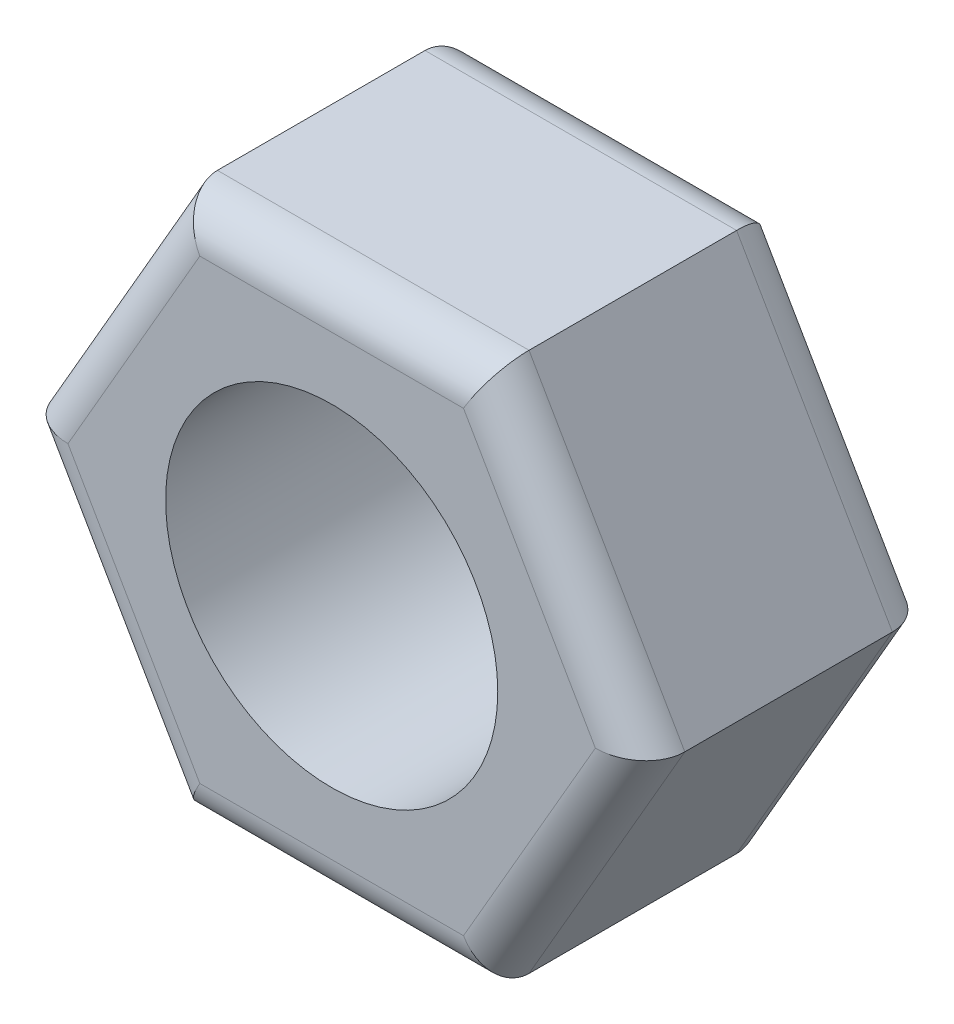
ISO-10303-21;
HEADER;
FILE_DESCRIPTION(('STEP AP214'),'2;1');
FILE_NAME('part.step','',(''),(''),'','','');
FILE_SCHEMA(('AUTOMOTIVE_DESIGN { 1 0 10303 214 1 1 1 1 }'));
ENDSEC;
DATA;
#1=APPLICATION_CONTEXT('core data for automotive mechanical design processes');
#2=APPLICATION_PROTOCOL_DEFINITION('international standard','automotive_design',2000,#1);
#3=PRODUCT_CONTEXT('',#1,'mechanical');
#4=PRODUCT('Part','Part','',(#3));
#5=PRODUCT_RELATED_PRODUCT_CATEGORY('part','',(#4));
#6=PRODUCT_DEFINITION_FORMATION('','',#4);
#7=PRODUCT_DEFINITION_CONTEXT('part definition',#1,'design');
#8=PRODUCT_DEFINITION('design','',#6,#7);
#9=PRODUCT_DEFINITION_SHAPE('','',#8);
#10=(LENGTH_UNIT() NAMED_UNIT(*) SI_UNIT(.MILLI.,.METRE.));
#11=(NAMED_UNIT(*) PLANE_ANGLE_UNIT() SI_UNIT($,.RADIAN.));
#12=(NAMED_UNIT(*) SI_UNIT($,.STERADIAN.) SOLID_ANGLE_UNIT());
#13=UNCERTAINTY_MEASURE_WITH_UNIT(LENGTH_MEASURE(1.E-05),#10,'distance_accuracy_value','');
#14=(GEOMETRIC_REPRESENTATION_CONTEXT(3) GLOBAL_UNCERTAINTY_ASSIGNED_CONTEXT((#13)) GLOBAL_UNIT_ASSIGNED_CONTEXT((#10,
#11,#12)) REPRESENTATION_CONTEXT('',''));
#15=CARTESIAN_POINT('',(0.,0.,0.));
#16=DIRECTION('',(0.,0.,1.));
#17=DIRECTION('',(1.,0.,0.));
#18=AXIS2_PLACEMENT_3D('',#15,#16,#17);
#19=CARTESIAN_POINT('',(0.,0.,3.5));
#20=DIRECTION('',(0.,0.,-1.));
#21=DIRECTION('',(-1.,0.,0.));
#22=AXIS2_PLACEMENT_3D('',#19,#20,#21);
#23=PLANE('',#22);
#24=DIRECTION('',(-0.5,0.866025403784439,0.));
#25=VECTOR('',#24,1.);
#26=CARTESIAN_POINT('',(2.38156986040721,1.375,3.5));
#27=LINE('',#26,#25);
#28=CARTESIAN_POINT('',(3.17542648054294,0.,3.5));
#29=VERTEX_POINT('',#28);
#30=CARTESIAN_POINT('',(1.58771324027147,2.75,3.5));
#31=VERTEX_POINT('',#30);
#32=EDGE_CURVE('E150',#29,#31,#27,.T.);
#33=ORIENTED_EDGE('',*,*,#32,.T.);
#34=DIRECTION('',(-1.,0.,0.));
#35=VECTOR('',#34,1.);
#36=CARTESIAN_POINT('',(0.,2.75,3.5));
#37=LINE('',#36,#35);
#38=CARTESIAN_POINT('',(-1.58771324027147,2.75,3.5));
#39=VERTEX_POINT('',#38);
#40=EDGE_CURVE('E131',#31,#39,#37,.T.);
#41=ORIENTED_EDGE('',*,*,#40,.T.);
#42=DIRECTION('',(-0.5,-0.866025403784438,0.));
#43=VECTOR('',#42,1.);
#44=CARTESIAN_POINT('',(-2.38156986040721,1.375,3.5));
#45=LINE('',#44,#43);
#46=CARTESIAN_POINT('',(-3.17542648054294,0.,3.5));
#47=VERTEX_POINT('',#46);
#48=EDGE_CURVE('E139',#39,#47,#45,.T.);
#49=ORIENTED_EDGE('',*,*,#48,.T.);
#50=DIRECTION('',(0.5,-0.866025403784439,0.));
#51=VECTOR('',#50,1.);
#52=CARTESIAN_POINT('',(-2.38156986040721,-1.375,3.5));
#53=LINE('',#52,#51);
#54=CARTESIAN_POINT('',(-1.58771324027147,-2.75,3.5));
#55=VERTEX_POINT('',#54);
#56=EDGE_CURVE('E145',#47,#55,#53,.T.);
#57=ORIENTED_EDGE('',*,*,#56,.T.);
#58=DIRECTION('',(1.,0.,0.));
#59=VECTOR('',#58,1.);
#60=CARTESIAN_POINT('',(0.,-2.75,3.5));
#61=LINE('',#60,#59);
#62=CARTESIAN_POINT('',(1.58771324027147,-2.75,3.5));
#63=VERTEX_POINT('',#62);
#64=EDGE_CURVE('E254',#55,#63,#61,.T.);
#65=ORIENTED_EDGE('',*,*,#64,.T.);
#66=DIRECTION('',(0.5,0.866025403784439,0.));
#67=VECTOR('',#66,1.);
#68=CARTESIAN_POINT('',(2.38156986040721,-1.375,3.5));
#69=LINE('',#68,#67);
#70=EDGE_CURVE('E155',#63,#29,#69,.T.);
#71=ORIENTED_EDGE('',*,*,#70,.T.);
#72=EDGE_LOOP('',(#33,#41,#49,#57,#65,#71));
#73=FACE_BOUND('',#72,.T.);
#74=CARTESIAN_POINT('',(0.,0.,3.5));
#75=DIRECTION('',(0.,0.,1.));
#76=DIRECTION('',(1.,0.,0.));
#77=AXIS2_PLACEMENT_3D('',#74,#75,#76);
#78=CIRCLE('',#77,2.);
#79=CARTESIAN_POINT('',(2.,0.,3.5));
#80=VERTEX_POINT('',#79);
#81=EDGE_CURVE('E278',#80,#80,#78,.T.);
#82=ORIENTED_EDGE('',*,*,#81,.F.);
#83=EDGE_LOOP('',(#82));
#84=FACE_BOUND('',#83,.T.);
#85=ADVANCED_FACE('F37',(#73,#84),#23,.F.);
#86=CARTESIAN_POINT('',(0.,0.,0.));
#87=DIRECTION('',(0.,0.,-1.));
#88=DIRECTION('',(-1.,0.,0.));
#89=AXIS2_PLACEMENT_3D('',#86,#87,#88);
#90=PLANE('',#89);
#91=DIRECTION('',(0.5,0.866025403784439,0.));
#92=VECTOR('',#91,1.);
#93=CARTESIAN_POINT('',(1.44337567297406,-3.,0.));
#94=LINE('',#93,#92);
#95=CARTESIAN_POINT('',(3.17542648054294,0.,0.));
#96=VERTEX_POINT('',#95);
#97=CARTESIAN_POINT('',(1.58771324027147,-2.75,0.));
#98=VERTEX_POINT('',#97);
#99=EDGE_CURVE('E46',#96,#98,#94,.F.);
#100=ORIENTED_EDGE('',*,*,#99,.T.);
#101=DIRECTION('',(1.,0.,0.));
#102=VECTOR('',#101,1.);
#103=CARTESIAN_POINT('',(-1.87638837486628,-2.75,0.));
#104=LINE('',#103,#102);
#105=CARTESIAN_POINT('',(-1.58771324027147,-2.75,0.));
#106=VERTEX_POINT('',#105);
#107=EDGE_CURVE('E11',#98,#106,#104,.F.);
#108=ORIENTED_EDGE('',*,*,#107,.T.);
#109=DIRECTION('',(0.5,-0.866025403784439,0.));
#110=VECTOR('',#109,1.);
#111=CARTESIAN_POINT('',(-3.31976404784035,0.250000000000002,0.));
#112=LINE('',#111,#110);
#113=CARTESIAN_POINT('',(-3.17542648054294,0.,0.));
#114=VERTEX_POINT('',#113);
#115=EDGE_CURVE('E181',#106,#114,#112,.F.);
#116=ORIENTED_EDGE('',*,*,#115,.T.);
#117=DIRECTION('',(-0.5,-0.866025403784438,0.));
#118=VECTOR('',#117,1.);
#119=CARTESIAN_POINT('',(-1.44337567297406,3.,0.));
#120=LINE('',#119,#118);
#121=CARTESIAN_POINT('',(-1.58771324027147,2.75,0.));
#122=VERTEX_POINT('',#121);
#123=EDGE_CURVE('E183',#114,#122,#120,.F.);
#124=ORIENTED_EDGE('',*,*,#123,.T.);
#125=DIRECTION('',(-1.,0.,0.));
#126=VECTOR('',#125,1.);
#127=CARTESIAN_POINT('',(1.87638837486628,2.75,0.));
#128=LINE('',#127,#126);
#129=CARTESIAN_POINT('',(1.58771324027147,2.75,0.));
#130=VERTEX_POINT('',#129);
#131=EDGE_CURVE('E185',#122,#130,#128,.F.);
#132=ORIENTED_EDGE('',*,*,#131,.T.);
#133=DIRECTION('',(-0.5,0.866025403784439,0.));
#134=VECTOR('',#133,1.);
#135=CARTESIAN_POINT('',(3.31976404784035,-0.250000000000001,0.));
#136=LINE('',#135,#134);
#137=EDGE_CURVE('E57',#130,#96,#136,.F.);
#138=ORIENTED_EDGE('',*,*,#137,.T.);
#139=EDGE_LOOP('',(#100,#108,#116,#124,#132,#138));
#140=FACE_BOUND('',#139,.T.);
#141=CARTESIAN_POINT('',(0.,0.,0.));
#142=DIRECTION('',(0.,0.,1.));
#143=DIRECTION('',(1.,0.,0.));
#144=AXIS2_PLACEMENT_3D('',#141,#142,#143);
#145=CIRCLE('',#144,2.);
#146=CARTESIAN_POINT('',(2.,0.,0.));
#147=VERTEX_POINT('',#146);
#148=EDGE_CURVE('E200',#147,#147,#145,.T.);
#149=ORIENTED_EDGE('',*,*,#148,.T.);
#150=EDGE_LOOP('',(#149));
#151=FACE_BOUND('',#150,.T.);
#152=ADVANCED_FACE('F225',(#140,#151),#90,.T.);
#153=CARTESIAN_POINT('',(-1.87638837486628,-3.25,3.5));
#154=DIRECTION('',(0.866025403784439,0.5,0.));
#155=DIRECTION('',(-0.5,0.866025403784439,0.));
#156=AXIS2_PLACEMENT_3D('',#153,#154,#155);
#157=PLANE('',#156);
#158=DIRECTION('',(0.,0.,-1.));
#159=VECTOR('',#158,1.);
#160=CARTESIAN_POINT('',(-1.87638837486628,-3.25,3.5));
#161=LINE('',#160,#159);
#162=CARTESIAN_POINT('',(-1.87638837486628,-3.25,3.));
#163=VERTEX_POINT('',#162);
#164=CARTESIAN_POINT('',(-1.87638837486628,-3.25,0.5));
#165=VERTEX_POINT('',#164);
#166=EDGE_CURVE('E238',#163,#165,#161,.T.);
#167=ORIENTED_EDGE('',*,*,#166,.F.);
#168=DIRECTION('',(0.5,-0.866025403784439,0.));
#169=VECTOR('',#168,1.);
#170=CARTESIAN_POINT('',(-1.87638837486628,-3.25,3.));
#171=LINE('',#170,#169);
#172=CARTESIAN_POINT('',(-3.75277674973257,0.,3.));
#173=VERTEX_POINT('',#172);
#174=EDGE_CURVE('E175',#163,#173,#171,.F.);
#175=ORIENTED_EDGE('',*,*,#174,.T.);
#176=DIRECTION('',(0.,0.,-1.));
#177=VECTOR('',#176,1.);
#178=CARTESIAN_POINT('',(-3.75277674973257,0.,3.5));
#179=LINE('',#178,#177);
#180=CARTESIAN_POINT('',(-3.75277674973257,0.,0.5));
#181=VERTEX_POINT('',#180);
#182=EDGE_CURVE('E146',#173,#181,#179,.T.);
#183=ORIENTED_EDGE('',*,*,#182,.T.);
#184=DIRECTION('',(0.5,-0.866025403784439,0.));
#185=VECTOR('',#184,1.);
#186=CARTESIAN_POINT('',(-1.87638837486628,-3.25,0.5));
#187=LINE('',#186,#185);
#188=EDGE_CURVE('E173',#181,#165,#187,.T.);
#189=ORIENTED_EDGE('',*,*,#188,.T.);
#190=EDGE_LOOP('',(#167,#175,#183,#189));
#191=FACE_BOUND('',#190,.T.);
#192=ADVANCED_FACE('F237',(#191),#157,.F.);
#193=CARTESIAN_POINT('',(1.87638837486628,-3.25,3.5));
#194=DIRECTION('',(0.,1.,0.));
#195=DIRECTION('',(-1.,0.,0.));
#196=AXIS2_PLACEMENT_3D('',#193,#194,#195);
#197=PLANE('',#196);
#198=DIRECTION('',(0.,0.,-1.));
#199=VECTOR('',#198,1.);
#200=CARTESIAN_POINT('',(1.87638837486628,-3.25,3.5));
#201=LINE('',#200,#199);
#202=CARTESIAN_POINT('',(1.87638837486628,-3.25,3.));
#203=VERTEX_POINT('',#202);
#204=CARTESIAN_POINT('',(1.87638837486628,-3.25,0.5));
#205=VERTEX_POINT('',#204);
#206=EDGE_CURVE('E246',#203,#205,#201,.T.);
#207=ORIENTED_EDGE('',*,*,#206,.F.);
#208=DIRECTION('',(1.,0.,0.));
#209=VECTOR('',#208,1.);
#210=CARTESIAN_POINT('',(1.87638837486628,-3.25,3.));
#211=LINE('',#210,#209);
#212=EDGE_CURVE('E171',#203,#163,#211,.F.);
#213=ORIENTED_EDGE('',*,*,#212,.T.);
#214=ORIENTED_EDGE('',*,*,#166,.T.);
#215=DIRECTION('',(1.,0.,0.));
#216=VECTOR('',#215,1.);
#217=CARTESIAN_POINT('',(1.87638837486628,-3.25,0.5));
#218=LINE('',#217,#216);
#219=EDGE_CURVE('E168',#165,#205,#218,.T.);
#220=ORIENTED_EDGE('',*,*,#219,.T.);
#221=EDGE_LOOP('',(#207,#213,#214,#220));
#222=FACE_BOUND('',#221,.T.);
#223=ADVANCED_FACE('F243',(#222),#197,.F.);
#224=CARTESIAN_POINT('',(3.75277674973257,0.,3.5));
#225=DIRECTION('',(-0.866025403784439,0.5,0.));
#226=DIRECTION('',(-0.5,-0.866025403784439,0.));
#227=AXIS2_PLACEMENT_3D('',#224,#225,#226);
#228=PLANE('',#227);
#229=DIRECTION('',(0.,0.,-1.));
#230=VECTOR('',#229,1.);
#231=CARTESIAN_POINT('',(3.75277674973257,0.,3.5));
#232=LINE('',#231,#230);
#233=CARTESIAN_POINT('',(3.75277674973257,0.,3.));
#234=VERTEX_POINT('',#233);
#235=CARTESIAN_POINT('',(3.75277674973257,0.,0.5));
#236=VERTEX_POINT('',#235);
#237=EDGE_CURVE('E249',#234,#236,#232,.T.);
#238=ORIENTED_EDGE('',*,*,#237,.F.);
#239=DIRECTION('',(0.5,0.866025403784439,0.));
#240=VECTOR('',#239,1.);
#241=CARTESIAN_POINT('',(3.75277674973257,0.,3.));
#242=LINE('',#241,#240);
#243=EDGE_CURVE('E166',#234,#203,#242,.F.);
#244=ORIENTED_EDGE('',*,*,#243,.T.);
#245=ORIENTED_EDGE('',*,*,#206,.T.);
#246=DIRECTION('',(0.5,0.866025403784439,0.));
#247=VECTOR('',#246,1.);
#248=CARTESIAN_POINT('',(3.75277674973257,0.,0.5));
#249=LINE('',#248,#247);
#250=EDGE_CURVE('E164',#205,#236,#249,.T.);
#251=ORIENTED_EDGE('',*,*,#250,.T.);
#252=EDGE_LOOP('',(#238,#244,#245,#251));
#253=FACE_BOUND('',#252,.T.);
#254=ADVANCED_FACE('F304',(#253),#228,.F.);
#255=CARTESIAN_POINT('',(1.87638837486628,3.25,3.5));
#256=DIRECTION('',(-0.866025403784439,-0.5,0.));
#257=DIRECTION('',(0.5,-0.866025403784439,0.));
#258=AXIS2_PLACEMENT_3D('',#255,#256,#257);
#259=PLANE('',#258);
#260=DIRECTION('',(0.,0.,-1.));
#261=VECTOR('',#260,1.);
#262=CARTESIAN_POINT('',(1.87638837486628,3.25,3.5));
#263=LINE('',#262,#261);
#264=CARTESIAN_POINT('',(1.87638837486628,3.25,3.));
#265=VERTEX_POINT('',#264);
#266=CARTESIAN_POINT('',(1.87638837486628,3.25,0.5));
#267=VERTEX_POINT('',#266);
#268=EDGE_CURVE('E273',#265,#267,#263,.T.);
#269=ORIENTED_EDGE('',*,*,#268,.F.);
#270=DIRECTION('',(-0.5,0.866025403784439,0.));
#271=VECTOR('',#270,1.);
#272=CARTESIAN_POINT('',(1.87638837486628,3.25,3.));
#273=LINE('',#272,#271);
#274=EDGE_CURVE('E162',#265,#234,#273,.F.);
#275=ORIENTED_EDGE('',*,*,#274,.T.);
#276=ORIENTED_EDGE('',*,*,#237,.T.);
#277=DIRECTION('',(-0.5,0.866025403784439,0.));
#278=VECTOR('',#277,1.);
#279=CARTESIAN_POINT('',(1.87638837486628,3.25,0.5));
#280=LINE('',#279,#278);
#281=EDGE_CURVE('E160',#236,#267,#280,.T.);
#282=ORIENTED_EDGE('',*,*,#281,.T.);
#283=EDGE_LOOP('',(#269,#275,#276,#282));
#284=FACE_BOUND('',#283,.T.);
#285=ADVANCED_FACE('F276',(#284),#259,.F.);
#286=CARTESIAN_POINT('',(-1.87638837486628,3.25,3.5));
#287=DIRECTION('',(0.,-1.,0.));
#288=DIRECTION('',(1.,0.,0.));
#289=AXIS2_PLACEMENT_3D('',#286,#287,#288);
#290=PLANE('',#289);
#291=DIRECTION('',(0.,0.,-1.));
#292=VECTOR('',#291,1.);
#293=CARTESIAN_POINT('',(-1.87638837486628,3.25,3.5));
#294=LINE('',#293,#292);
#295=CARTESIAN_POINT('',(-1.87638837486628,3.25,3.));
#296=VERTEX_POINT('',#295);
#297=CARTESIAN_POINT('',(-1.87638837486628,3.25,0.5));
#298=VERTEX_POINT('',#297);
#299=EDGE_CURVE('E275',#296,#298,#294,.T.);
#300=ORIENTED_EDGE('',*,*,#299,.F.);
#301=DIRECTION('',(-1.,0.,0.));
#302=VECTOR('',#301,1.);
#303=CARTESIAN_POINT('',(-1.87638837486628,3.25,3.));
#304=LINE('',#303,#302);
#305=EDGE_CURVE('E133',#296,#265,#304,.F.);
#306=ORIENTED_EDGE('',*,*,#305,.T.);
#307=ORIENTED_EDGE('',*,*,#268,.T.);
#308=DIRECTION('',(-1.,0.,0.));
#309=VECTOR('',#308,1.);
#310=CARTESIAN_POINT('',(-1.87638837486628,3.25,0.5));
#311=LINE('',#310,#309);
#312=EDGE_CURVE('E152',#267,#298,#311,.T.);
#313=ORIENTED_EDGE('',*,*,#312,.T.);
#314=EDGE_LOOP('',(#300,#306,#307,#313));
#315=FACE_BOUND('',#314,.T.);
#316=ADVANCED_FACE('F272',(#315),#290,.F.);
#317=CARTESIAN_POINT('',(-2.81458256229943,1.625,3.5));
#318=DIRECTION('',(0.866025403784438,-0.5,0.));
#319=DIRECTION('',(0.5,0.866025403784438,0.));
#320=AXIS2_PLACEMENT_3D('',#317,#318,#319);
#321=PLANE('',#320);
#322=ORIENTED_EDGE('',*,*,#182,.F.);
#323=DIRECTION('',(-0.5,-0.866025403784438,0.));
#324=VECTOR('',#323,1.);
#325=CARTESIAN_POINT('',(-2.81458256229943,1.625,3.));
#326=LINE('',#325,#324);
#327=EDGE_CURVE('E179',#173,#296,#326,.F.);
#328=ORIENTED_EDGE('',*,*,#327,.T.);
#329=ORIENTED_EDGE('',*,*,#299,.T.);
#330=DIRECTION('',(-0.5,-0.866025403784438,0.));
#331=VECTOR('',#330,1.);
#332=CARTESIAN_POINT('',(-3.75277674973257,0.,0.5));
#333=LINE('',#332,#331);
#334=EDGE_CURVE('E177',#298,#181,#333,.T.);
#335=ORIENTED_EDGE('',*,*,#334,.T.);
#336=EDGE_LOOP('',(#322,#328,#329,#335));
#337=FACE_BOUND('',#336,.T.);
#338=ADVANCED_FACE('F296',(#337),#321,.F.);
#339=CARTESIAN_POINT('',(0.,0.,3.5));
#340=DIRECTION('',(0.,0.,-1.));
#341=DIRECTION('',(-1.,0.,0.));
#342=AXIS2_PLACEMENT_3D('',#339,#340,#341);
#343=CYLINDRICAL_SURFACE('',#342,2.);
#344=ORIENTED_EDGE('',*,*,#81,.T.);
#345=EDGE_LOOP('',(#344));
#346=FACE_BOUND('',#345,.T.);
#347=ORIENTED_EDGE('',*,*,#148,.F.);
#348=EDGE_LOOP('',(#347));
#349=FACE_BOUND('',#348,.T.);
#350=ADVANCED_FACE('F286',(#346,#349),#343,.F.);
#351=CARTESIAN_POINT('',(0.,-2.75,3.));
#352=DIRECTION('',(1.,0.,0.));
#353=DIRECTION('',(0.,1.,0.));
#354=AXIS2_PLACEMENT_3D('',#351,#352,#353);
#355=CYLINDRICAL_SURFACE('',#354,0.5);
#356=CARTESIAN_POINT('',(-1.58771324027147,-2.75,3.));
#357=DIRECTION('',(0.866025403784439,-0.5,0.));
#358=DIRECTION('',(-0.5,-0.866025403784439,0.));
#359=AXIS2_PLACEMENT_3D('',#356,#357,#358);
#360=ELLIPSE('',#359,0.577350269189626,0.5);
#361=EDGE_CURVE('E194',#163,#55,#360,.F.);
#362=ORIENTED_EDGE('',*,*,#361,.F.);
#363=ORIENTED_EDGE('',*,*,#212,.F.);
#364=CARTESIAN_POINT('',(1.58771324027147,-2.75,3.));
#365=DIRECTION('',(0.866025403784439,0.5,0.));
#366=DIRECTION('',(0.5,-0.866025403784439,0.));
#367=AXIS2_PLACEMENT_3D('',#364,#365,#366);
#368=ELLIPSE('',#367,0.577350269189626,0.5);
#369=EDGE_CURVE('E197',#63,#203,#368,.T.);
#370=ORIENTED_EDGE('',*,*,#369,.F.);
#371=ORIENTED_EDGE('',*,*,#64,.F.);
#372=EDGE_LOOP('',(#362,#363,#370,#371));
#373=FACE_BOUND('',#372,.T.);
#374=ADVANCED_FACE('F324',(#373),#355,.T.);
#375=CARTESIAN_POINT('',(2.38156986040721,-1.375,3.));
#376=DIRECTION('',(0.5,0.866025403784439,0.));
#377=DIRECTION('',(-0.866025403784439,0.5,0.));
#378=AXIS2_PLACEMENT_3D('',#375,#376,#377);
#379=CYLINDRICAL_SURFACE('',#378,0.5);
#380=ORIENTED_EDGE('',*,*,#369,.T.);
#381=ORIENTED_EDGE('',*,*,#243,.F.);
#382=CARTESIAN_POINT('',(3.17542648054294,0.,3.));
#383=DIRECTION('',(0.,1.,0.));
#384=DIRECTION('',(1.,0.,0.));
#385=AXIS2_PLACEMENT_3D('',#382,#383,#384);
#386=ELLIPSE('',#385,0.577350269189626,0.5);
#387=EDGE_CURVE('E191',#29,#234,#386,.T.);
#388=ORIENTED_EDGE('',*,*,#387,.F.);
#389=ORIENTED_EDGE('',*,*,#70,.F.);
#390=EDGE_LOOP('',(#380,#381,#388,#389));
#391=FACE_BOUND('',#390,.T.);
#392=ADVANCED_FACE('F261',(#391),#379,.T.);
#393=CARTESIAN_POINT('',(-2.38156986040721,-1.375,3.));
#394=DIRECTION('',(0.5,-0.866025403784439,0.));
#395=DIRECTION('',(0.866025403784439,0.5,0.));
#396=AXIS2_PLACEMENT_3D('',#393,#394,#395);
#397=CYLINDRICAL_SURFACE('',#396,0.5);
#398=ORIENTED_EDGE('',*,*,#361,.T.);
#399=ORIENTED_EDGE('',*,*,#56,.F.);
#400=CARTESIAN_POINT('',(-3.17542648054294,0.,3.));
#401=DIRECTION('',(0.,-1.,0.));
#402=DIRECTION('',(-1.,0.,0.));
#403=AXIS2_PLACEMENT_3D('',#400,#401,#402);
#404=ELLIPSE('',#403,0.577350269189626,0.5);
#405=EDGE_CURVE('E142',#173,#47,#404,.F.);
#406=ORIENTED_EDGE('',*,*,#405,.F.);
#407=ORIENTED_EDGE('',*,*,#174,.F.);
#408=EDGE_LOOP('',(#398,#399,#406,#407));
#409=FACE_BOUND('',#408,.T.);
#410=ADVANCED_FACE('F318',(#409),#397,.T.);
#411=CARTESIAN_POINT('',(2.38156986040721,1.375,3.));
#412=DIRECTION('',(-0.5,0.866025403784439,0.));
#413=DIRECTION('',(-0.866025403784439,-0.5,0.));
#414=AXIS2_PLACEMENT_3D('',#411,#412,#413);
#415=CYLINDRICAL_SURFACE('',#414,0.5);
#416=ORIENTED_EDGE('',*,*,#387,.T.);
#417=ORIENTED_EDGE('',*,*,#274,.F.);
#418=CARTESIAN_POINT('',(1.58771324027147,2.75,3.));
#419=DIRECTION('',(-0.866025403784439,0.5,0.));
#420=DIRECTION('',(0.5,0.866025403784439,0.));
#421=AXIS2_PLACEMENT_3D('',#418,#419,#420);
#422=ELLIPSE('',#421,0.577350269189626,0.5);
#423=EDGE_CURVE('E136',#31,#265,#422,.T.);
#424=ORIENTED_EDGE('',*,*,#423,.F.);
#425=ORIENTED_EDGE('',*,*,#32,.F.);
#426=EDGE_LOOP('',(#416,#417,#424,#425));
#427=FACE_BOUND('',#426,.T.);
#428=ADVANCED_FACE('F264',(#427),#415,.T.);
#429=CARTESIAN_POINT('',(-2.38156986040721,1.375,3.));
#430=DIRECTION('',(-0.5,-0.866025403784438,0.));
#431=DIRECTION('',(0.866025403784438,-0.5,0.));
#432=AXIS2_PLACEMENT_3D('',#429,#430,#431);
#433=CYLINDRICAL_SURFACE('',#432,0.5);
#434=ORIENTED_EDGE('',*,*,#405,.T.);
#435=ORIENTED_EDGE('',*,*,#48,.F.);
#436=CARTESIAN_POINT('',(-1.58771324027147,2.75,3.));
#437=DIRECTION('',(-0.866025403784439,-0.5,0.));
#438=DIRECTION('',(0.5,-0.866025403784439,0.));
#439=AXIS2_PLACEMENT_3D('',#436,#437,#438);
#440=ELLIPSE('',#439,0.577350269189626,0.5);
#441=EDGE_CURVE('E127',#296,#39,#440,.F.);
#442=ORIENTED_EDGE('',*,*,#441,.F.);
#443=ORIENTED_EDGE('',*,*,#327,.F.);
#444=EDGE_LOOP('',(#434,#435,#442,#443));
#445=FACE_BOUND('',#444,.T.);
#446=ADVANCED_FACE('F140',(#445),#433,.T.);
#447=CARTESIAN_POINT('',(0.,2.75,3.));
#448=DIRECTION('',(-1.,0.,0.));
#449=DIRECTION('',(0.,-1.,0.));
#450=AXIS2_PLACEMENT_3D('',#447,#448,#449);
#451=CYLINDRICAL_SURFACE('',#450,0.5);
#452=ORIENTED_EDGE('',*,*,#423,.T.);
#453=ORIENTED_EDGE('',*,*,#305,.F.);
#454=ORIENTED_EDGE('',*,*,#441,.T.);
#455=ORIENTED_EDGE('',*,*,#40,.F.);
#456=EDGE_LOOP('',(#452,#453,#454,#455));
#457=FACE_BOUND('',#456,.T.);
#458=ADVANCED_FACE('F129',(#457),#451,.T.);
#459=CARTESIAN_POINT('',(-1.87638837486628,2.75,0.5));
#460=DIRECTION('',(1.,0.,0.));
#461=DIRECTION('',(0.,1.,0.));
#462=AXIS2_PLACEMENT_3D('',#459,#460,#461);
#463=CYLINDRICAL_SURFACE('',#462,0.5);
#464=CARTESIAN_POINT('',(1.58771324027147,2.75,0.5));
#465=DIRECTION('',(0.866025403784439,-0.5,0.));
#466=DIRECTION('',(0.5,0.866025403784439,0.));
#467=AXIS2_PLACEMENT_3D('',#464,#465,#466);
#468=ELLIPSE('',#467,0.577350269189626,0.5);
#469=EDGE_CURVE('E210',#130,#267,#468,.T.);
#470=ORIENTED_EDGE('',*,*,#469,.F.);
#471=ORIENTED_EDGE('',*,*,#131,.F.);
#472=CARTESIAN_POINT('',(-1.58771324027147,2.75,0.5));
#473=DIRECTION('',(0.866025403784439,0.5,0.));
#474=DIRECTION('',(-0.5,0.866025403784439,0.));
#475=AXIS2_PLACEMENT_3D('',#472,#473,#474);
#476=ELLIPSE('',#475,0.577350269189626,0.5);
#477=EDGE_CURVE('E41',#298,#122,#476,.F.);
#478=ORIENTED_EDGE('',*,*,#477,.F.);
#479=ORIENTED_EDGE('',*,*,#312,.F.);
#480=EDGE_LOOP('',(#470,#471,#478,#479));
#481=FACE_BOUND('',#480,.T.);
#482=ADVANCED_FACE('F39',(#481),#463,.T.);
#483=CARTESIAN_POINT('',(-2.38156986040721,1.375,0.5));
#484=DIRECTION('',(0.5,0.866025403784438,0.));
#485=DIRECTION('',(-0.866025403784438,0.5,0.));
#486=AXIS2_PLACEMENT_3D('',#483,#484,#485);
#487=CYLINDRICAL_SURFACE('',#486,0.5);
#488=ORIENTED_EDGE('',*,*,#477,.T.);
#489=ORIENTED_EDGE('',*,*,#123,.F.);
#490=CARTESIAN_POINT('',(-3.17542648054294,0.,0.5));
#491=DIRECTION('',(0.,1.,0.));
#492=DIRECTION('',(-1.,0.,0.));
#493=AXIS2_PLACEMENT_3D('',#490,#491,#492);
#494=ELLIPSE('',#493,0.577350269189626,0.5);
#495=EDGE_CURVE('E208',#181,#114,#494,.F.);
#496=ORIENTED_EDGE('',*,*,#495,.F.);
#497=ORIENTED_EDGE('',*,*,#334,.F.);
#498=EDGE_LOOP('',(#488,#489,#496,#497));
#499=FACE_BOUND('',#498,.T.);
#500=ADVANCED_FACE('F220',(#499),#487,.T.);
#501=CARTESIAN_POINT('',(1.44337567297406,3.,0.5));
#502=DIRECTION('',(0.5,-0.866025403784439,0.));
#503=DIRECTION('',(0.866025403784439,0.5,0.));
#504=AXIS2_PLACEMENT_3D('',#501,#502,#503);
#505=CYLINDRICAL_SURFACE('',#504,0.5);
#506=ORIENTED_EDGE('',*,*,#469,.T.);
#507=ORIENTED_EDGE('',*,*,#281,.F.);
#508=CARTESIAN_POINT('',(3.17542648054294,0.,0.5));
#509=DIRECTION('',(0.,-1.,0.));
#510=DIRECTION('',(1.,0.,0.));
#511=AXIS2_PLACEMENT_3D('',#508,#509,#510);
#512=ELLIPSE('',#511,0.577350269189626,0.5);
#513=EDGE_CURVE('E205',#96,#236,#512,.T.);
#514=ORIENTED_EDGE('',*,*,#513,.F.);
#515=ORIENTED_EDGE('',*,*,#137,.F.);
#516=EDGE_LOOP('',(#506,#507,#514,#515));
#517=FACE_BOUND('',#516,.T.);
#518=ADVANCED_FACE('F338',(#517),#505,.T.);
#519=CARTESIAN_POINT('',(-1.44337567297406,-3.,0.5));
#520=DIRECTION('',(-0.5,0.866025403784439,0.));
#521=DIRECTION('',(-0.866025403784439,-0.5,0.));
#522=AXIS2_PLACEMENT_3D('',#519,#520,#521);
#523=CYLINDRICAL_SURFACE('',#522,0.5);
#524=ORIENTED_EDGE('',*,*,#495,.T.);
#525=ORIENTED_EDGE('',*,*,#115,.F.);
#526=CARTESIAN_POINT('',(-1.58771324027147,-2.75,0.5));
#527=DIRECTION('',(-0.866025403784439,0.5,0.));
#528=DIRECTION('',(0.5,0.866025403784439,0.));
#529=AXIS2_PLACEMENT_3D('',#526,#527,#528);
#530=ELLIPSE('',#529,0.577350269189626,0.5);
#531=EDGE_CURVE('E203',#165,#106,#530,.F.);
#532=ORIENTED_EDGE('',*,*,#531,.F.);
#533=ORIENTED_EDGE('',*,*,#188,.F.);
#534=EDGE_LOOP('',(#524,#525,#532,#533));
#535=FACE_BOUND('',#534,.T.);
#536=ADVANCED_FACE('F230',(#535),#523,.T.);
#537=CARTESIAN_POINT('',(3.31976404784035,0.25,0.5));
#538=DIRECTION('',(-0.5,-0.866025403784439,0.));
#539=DIRECTION('',(0.866025403784439,-0.5,0.));
#540=AXIS2_PLACEMENT_3D('',#537,#538,#539);
#541=CYLINDRICAL_SURFACE('',#540,0.5);
#542=ORIENTED_EDGE('',*,*,#513,.T.);
#543=ORIENTED_EDGE('',*,*,#250,.F.);
#544=CARTESIAN_POINT('',(1.58771324027147,-2.75,0.5));
#545=DIRECTION('',(-0.866025403784439,-0.5,0.));
#546=DIRECTION('',(0.5,-0.866025403784439,0.));
#547=AXIS2_PLACEMENT_3D('',#544,#545,#546);
#548=ELLIPSE('',#547,0.577350269189626,0.5);
#549=EDGE_CURVE('E201',#98,#205,#548,.T.);
#550=ORIENTED_EDGE('',*,*,#549,.F.);
#551=ORIENTED_EDGE('',*,*,#99,.F.);
#552=EDGE_LOOP('',(#542,#543,#550,#551));
#553=FACE_BOUND('',#552,.T.);
#554=ADVANCED_FACE('F331',(#553),#541,.T.);
#555=CARTESIAN_POINT('',(1.87638837486628,-2.75,0.5));
#556=DIRECTION('',(-1.,0.,0.));
#557=DIRECTION('',(0.,-1.,0.));
#558=AXIS2_PLACEMENT_3D('',#555,#556,#557);
#559=CYLINDRICAL_SURFACE('',#558,0.5);
#560=ORIENTED_EDGE('',*,*,#531,.T.);
#561=ORIENTED_EDGE('',*,*,#107,.F.);
#562=ORIENTED_EDGE('',*,*,#549,.T.);
#563=ORIENTED_EDGE('',*,*,#219,.F.);
#564=EDGE_LOOP('',(#560,#561,#562,#563));
#565=FACE_BOUND('',#564,.T.);
#566=ADVANCED_FACE('F328',(#565),#559,.T.);
#567=CLOSED_SHELL('',(#85,#152,#192,#223,#254,#285,#316,#338,#350,#374,#392,#410,#428,#446,#458,
#482,#500,#518,#536,#554,#566));
#568=MANIFOLD_SOLID_BREP('B2',#567);
#569=ADVANCED_BREP_SHAPE_REPRESENTATION('',(#18,#568),#14);
#570=SHAPE_DEFINITION_REPRESENTATION(#9,#569);
ENDSEC;
END-ISO-10303-21;
